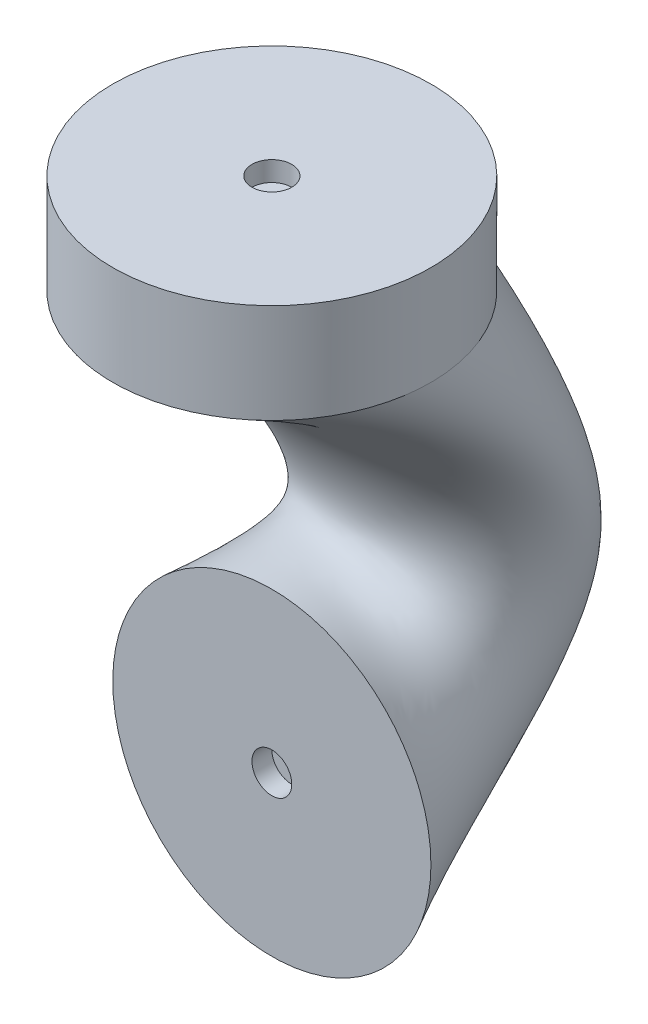
ISO-10303-21;
HEADER;
FILE_DESCRIPTION(('STEP AP214'),'2;1');
FILE_NAME('part.step','',(''),(''),'','','');
FILE_SCHEMA(('AUTOMOTIVE_DESIGN { 1 0 10303 214 1 1 1 1 }'));
ENDSEC;
DATA;
#1=APPLICATION_CONTEXT('core data for automotive mechanical design processes');
#2=APPLICATION_PROTOCOL_DEFINITION('international standard','automotive_design',2000,#1);
#3=PRODUCT_CONTEXT('',#1,'mechanical');
#4=PRODUCT('Part','Part','',(#3));
#5=PRODUCT_RELATED_PRODUCT_CATEGORY('part','',(#4));
#6=PRODUCT_DEFINITION_FORMATION('','',#4);
#7=PRODUCT_DEFINITION_CONTEXT('part definition',#1,'design');
#8=PRODUCT_DEFINITION('design','',#6,#7);
#9=PRODUCT_DEFINITION_SHAPE('','',#8);
#10=(LENGTH_UNIT() NAMED_UNIT(*) SI_UNIT(.MILLI.,.METRE.));
#11=(NAMED_UNIT(*) PLANE_ANGLE_UNIT() SI_UNIT($,.RADIAN.));
#12=(NAMED_UNIT(*) SI_UNIT($,.STERADIAN.) SOLID_ANGLE_UNIT());
#13=UNCERTAINTY_MEASURE_WITH_UNIT(LENGTH_MEASURE(1.E-05),#10,'distance_accuracy_value','');
#14=(GEOMETRIC_REPRESENTATION_CONTEXT(3) GLOBAL_UNCERTAINTY_ASSIGNED_CONTEXT((#13)) GLOBAL_UNIT_ASSIGNED_CONTEXT((#10,
#11,#12)) REPRESENTATION_CONTEXT('',''));
#15=CARTESIAN_POINT('',(0.,0.,0.));
#16=DIRECTION('',(0.,0.,1.));
#17=DIRECTION('',(1.,0.,0.));
#18=AXIS2_PLACEMENT_3D('',#15,#16,#17);
#19=CARTESIAN_POINT('',(0.,200.,-2.08794990940197E-12));
#20=DIRECTION('',(0.,1.,0.));
#21=DIRECTION('',(-1.,0.,0.));
#22=AXIS2_PLACEMENT_3D('',#19,#20,#21);
#23=CYLINDRICAL_SURFACE('',#22,10.);
#24=CARTESIAN_POINT('',(0.,250.,-2.61167211022844E-12));
#25=DIRECTION('',(0.,1.,0.));
#26=DIRECTION('',(-1.,0.,0.));
#27=AXIS2_PLACEMENT_3D('',#24,#25,#26);
#28=CIRCLE('',#27,10.);
#29=CARTESIAN_POINT('',(-10.,250.,-2.61167211022844E-12));
#30=VERTEX_POINT('',#29);
#31=EDGE_CURVE('E199',#30,#30,#28,.T.);
#32=ORIENTED_EDGE('',*,*,#31,.F.);
#33=EDGE_LOOP('',(#32));
#34=FACE_BOUND('',#33,.T.);
#35=CARTESIAN_POINT('',(0.,260.,-2.71641655039374E-12));
#36=DIRECTION('',(0.,1.,0.));
#37=DIRECTION('',(-1.,0.,0.));
#38=AXIS2_PLACEMENT_3D('',#35,#36,#37);
#39=CIRCLE('',#38,10.);
#40=CARTESIAN_POINT('',(-10.,260.,-2.71641655039374E-12));
#41=VERTEX_POINT('',#40);
#42=EDGE_CURVE('E202',#41,#41,#39,.T.);
#43=ORIENTED_EDGE('',*,*,#42,.T.);
#44=EDGE_LOOP('',(#43));
#45=FACE_BOUND('',#44,.T.);
#46=ADVANCED_FACE('F95',(#34,#45),#23,.F.);
#47=CARTESIAN_POINT('',(0.,0.,0.));
#48=DIRECTION('',(0.,0.,1.));
#49=DIRECTION('',(0.,-1.,0.));
#50=AXIS2_PLACEMENT_3D('',#47,#48,#49);
#51=PLANE('',#50);
#52=CARTESIAN_POINT('',(0.,0.,0.));
#53=DIRECTION('',(0.,0.,1.));
#54=DIRECTION('',(0.,-1.,0.));
#55=AXIS2_PLACEMENT_3D('',#52,#53,#54);
#56=CIRCLE('',#55,10.);
#57=CARTESIAN_POINT('',(0.,-10.,1.11683334069202E-13));
#58=VERTEX_POINT('',#57);
#59=EDGE_CURVE('E108',#58,#58,#56,.T.);
#60=ORIENTED_EDGE('',*,*,#59,.F.);
#61=EDGE_LOOP('',(#60));
#62=FACE_BOUND('',#61,.T.);
#63=CARTESIAN_POINT('',(74.3766084181839,29.4638782275543,-3.01678849100449E-13));
#64=CARTESIAN_POINT('',(74.7673126786554,28.4776109899567,-2.91348248134896E-13));
#65=CARTESIAN_POINT('',(75.5079415287326,26.4935866791247,-2.70566696563654E-13));
#66=CARTESIAN_POINT('',(76.4966022293078,23.4867166769649,-2.39071405061049E-13));
#67=CARTESIAN_POINT('',(77.3630367933986,20.4526491098914,-2.0729123418737E-13));
#68=CARTESIAN_POINT('',(81.8286259873764,2.10687414395702,0.));
#69=CARTESIAN_POINT('',(80.1643381849054,-16.1794419388319,1.7640955271089E-13));
#70=CARTESIAN_POINT('',(65.0037798739216,-51.231413755101,5.43559469169367E-13));
#71=CARTESIAN_POINT('',(49.1892229795066,-66.5625232087544,7.04144316852945E-13));
#72=CARTESIAN_POINT('',(9.7385334756019,-82.1906936276132,8.67840712986062E-13));
#73=CARTESIAN_POINT('',(-12.2847784036909,-81.8488446639036,8.64260035153576E-13));
#74=CARTESIAN_POINT('',(-51.231413755101,-65.0037798739216,6.87817347056099E-13));
#75=CARTESIAN_POINT('',(-66.5625232087544,-49.1892229795066,5.22168656219331E-13));
#76=CARTESIAN_POINT('',(-82.1906936276132,-9.73853347560186,1.08944617597196E-13));
#77=CARTESIAN_POINT('',(-81.8488446639035,12.284778403691,-1.21737329741023E-13));
#78=CARTESIAN_POINT('',(-65.0037798739215,51.231413755101,-5.29681681361553E-13));
#79=CARTESIAN_POINT('',(-49.1892229795066,66.5625232087545,-6.90266529045131E-13));
#80=CARTESIAN_POINT('',(-9.73853347560179,82.1906936276132,-8.53962925178247E-13));
#81=CARTESIAN_POINT('',(12.284778403691,81.8488446639035,-8.50382247345761E-13));
#82=CARTESIAN_POINT('',(47.3367502199601,66.6882863529197,-6.91583828058032E-13));
#83=CARTESIAN_POINT('',(61.0723686533143,54.5025571575691,-5.63945089800744E-13));
#84=CARTESIAN_POINT('',(70.3817879461326,38.0756384452672,-3.91882249384659E-13));
#85=CARTESIAN_POINT('',(71.8281958006555,35.2713240595763,-3.62508615346991E-13));
#86=CARTESIAN_POINT('',(73.1669105155484,32.4031260010594,-3.32465835354738E-13));
#87=CARTESIAN_POINT('',(73.9859041577124,30.4501454651519,-3.12009450066003E-13));
#88=CARTESIAN_POINT('',(74.3766084181839,29.4638782275543,-3.01678849100449E-13));
#89=B_SPLINE_CURVE_WITH_KNOTS('',3,(#63,#64,#65,#66,#67,#68,#69,#70,#71,#72,#73,#74,#75,#76,#77,
#78,#79,#80,#81,#82,#83,#84,#85,#86,#87,#88),.UNSPECIFIED.,.T.,.F.,(4,1,1,1,1,2,2,2,2,2,2,2,1,1,
1,1,4),(0.,0.00624999999999998,0.0125,0.01875,0.025,0.125,0.25,0.375,0.5,0.625,0.75,0.875,0.975,
0.98125,0.9875,0.99375,1.),.UNSPECIFIED.);
#90=CARTESIAN_POINT('',(74.3766084181839,29.4638782275543,-3.01678849100449E-13));
#91=VERTEX_POINT('',#90);
#92=EDGE_CURVE('E13',#91,#91,#89,.F.);
#93=ORIENTED_EDGE('',*,*,#92,.T.);
#94=EDGE_LOOP('',(#93));
#95=FACE_BOUND('',#94,.T.);
#96=ADVANCED_FACE('F139',(#62,#95),#51,.T.);
#97=CARTESIAN_POINT('',(-20.9124445285288,210.000000000001,77.2183246635206));
#98=CARTESIAN_POINT('',(-16.479288510747,178.04697238756,16.927761124029));
#99=CARTESIAN_POINT('',(7.97290448844534,107.13554131218,-62.0648444365816));
#100=CARTESIAN_POINT('',(47.0467467870615,57.6895578725962,-34.551121984985));
#101=CARTESIAN_POINT('',(74.3766084181839,29.4638782275543,-3.01678849100449E-13));
#102=CARTESIAN_POINT('',(-21.9363942000385,210.000000000001,76.9410162552022));
#103=CARTESIAN_POINT('',(-17.4927921986531,177.979945678043,16.9046435709561));
#104=CARTESIAN_POINT('',(7.17327205318328,107.068014364211,-61.8219465113336));
#105=CARTESIAN_POINT('',(46.4556548678449,58.2804291611886,-34.3892585919848));
#106=CARTESIAN_POINT('',(73.9859041577124,30.4501454651519,-3.12009450066003E-13));
#107=CARTESIAN_POINT('',(-23.9690905377756,210.000000000001,76.3468536864642));
#108=CARTESIAN_POINT('',(-19.5081001496207,177.834286971107,16.8223465787438));
#109=CARTESIAN_POINT('',(5.57494905105683,106.910570300343,-61.3625131813319));
#110=CARTESIAN_POINT('',(45.2491202418078,59.4361879625734,-34.0756116562607));
#111=CARTESIAN_POINT('',(73.1669105155484,32.4031260010594,-3.32465835354738E-13));
#112=CARTESIAN_POINT('',(-26.9696470115506,210.000000000001,75.3391940026237));
#113=CARTESIAN_POINT('',(-22.4932864421283,177.583726124774,16.5879829908779));
#114=CARTESIAN_POINT('',(3.1807616188368,106.602020962716,-60.74914467564));
#115=CARTESIAN_POINT('',(43.3719676117689,61.0980029372616,-33.6381141342307));
#116=CARTESIAN_POINT('',(71.8281958006555,35.2713240595763,-3.62508615346991E-13));
#117=CARTESIAN_POINT('',(-29.9188364355118,210.000000000001,74.2173399136202));
#118=CARTESIAN_POINT('',(-25.4382889264136,177.301715327059,16.2458708953967));
#119=CARTESIAN_POINT('',(0.793734005269491,106.223171149149,-60.2131490258429));
#120=CARTESIAN_POINT('',(41.4288055890974,62.6854142087252,-33.2324287762188));
#121=CARTESIAN_POINT('',(70.3817879461326,38.0756384452672,-3.91882249384659E-13));
#122=CARTESIAN_POINT('',(-47.2884965784981,210.000000000001,66.8143775020428));
#123=CARTESIAN_POINT('',(-42.8434226237478,175.444138044519,13.5374584792941));
#124=CARTESIAN_POINT('',(-13.4766151837944,103.509672699927,-57.4454912167663));
#125=CARTESIAN_POINT('',(29.3966648848724,71.7805538864299,-31.0035343017287));
#126=CARTESIAN_POINT('',(61.0723686533143,54.5025571575691,-5.63945089800744E-13));
#127=CARTESIAN_POINT('',(-60.9416507336906,210.000000000001,54.536324261253));
#128=CARTESIAN_POINT('',(-57.2610773241044,172.024425936059,6.26274381397339));
#129=CARTESIAN_POINT('',(-26.1595926233857,97.909609061726,-58.8827898720736));
#130=CARTESIAN_POINT('',(14.9443371550057,76.4341278999874,-30.1661441659222));
#131=CARTESIAN_POINT('',(47.3367502199601,66.6882863529197,-6.91583828058032E-13));
#132=CARTESIAN_POINT('',(-79.9480343450779,210.,21.4117014177239));
#133=CARTESIAN_POINT('',(-78.5606727052289,165.836245671341,-19.0081835076799));
#134=CARTESIAN_POINT('',(-48.0120348784579,77.5366388457216,-67.6121429012748));
#135=CARTESIAN_POINT('',(-17.0968981768952,80.4635866197993,-33.193478029005));
#136=CARTESIAN_POINT('',(12.284778403691,81.8488446639035,-8.50382247345761E-13));
#137=CARTESIAN_POINT('',(-82.7644928298903,210.,-0.43345109833598));
#138=CARTESIAN_POINT('',(-83.1193803946188,163.130008735237,-38.3940674676732));
#139=CARTESIAN_POINT('',(-55.7527110097061,61.7069744385726,-76.0272432080755));
#140=CARTESIAN_POINT('',(-34.3028051911507,77.9682598912986,-38.2091014399269));
#141=CARTESIAN_POINT('',(-9.73853347560179,82.1906936276132,-8.53962925178247E-13));
#142=CARTESIAN_POINT('',(-71.6721564971553,210.,-41.391437958726));
#143=CARTESIAN_POINT('',(-72.578742837601,153.695545466485,-77.2488737113557));
#144=CARTESIAN_POINT('',(-61.7379569900093,35.1832013304957,-99.3536126940505));
#145=CARTESIAN_POINT('',(-57.7227227931111,58.026105534669,-49.5505803677284));
#146=CARTESIAN_POINT('',(-49.1892229795066,66.5625232087545,-6.90266529045131E-13));
#147=CARTESIAN_POINT('',(-58.2168379105362,209.999999999999,-58.8298303324276));
#148=CARTESIAN_POINT('',(-57.9328738221215,146.967319133838,-95.0433540244161));
#149=CARTESIAN_POINT('',(-60.2267518868738,25.8343240878391,-112.988471744801));
#150=CARTESIAN_POINT('',(-62.323912650619,41.2181878354547,-55.8764358846081));
#151=CARTESIAN_POINT('',(-65.0037798739215,51.231413755101,-5.29681681361553E-13));
#152=CARTESIAN_POINT('',(-21.4117014177261,209.999999999999,-79.94803434508));
#153=CARTESIAN_POINT('',(-22.7511635730298,137.138305121617,-118.833964112987));
#154=CARTESIAN_POINT('',(-40.7670448564351,14.5751927748329,-139.619097107991));
#155=CARTESIAN_POINT('',(-63.1761815509074,5.23156452586233,-65.4823058011237));
#156=CARTESIAN_POINT('',(-81.8488446639035,12.284778403691,-1.21737329741023E-13));
#157=CARTESIAN_POINT('',(0.433451098333731,209.999999999999,-82.7644928298925));
#158=CARTESIAN_POINT('',(-3.71998772954883,134.037517442044,-123.966740734358));
#159=CARTESIAN_POINT('',(-24.0873685804441,13.1662226176816,-151.192663392265));
#160=CARTESIAN_POINT('',(-58.7386016618304,-12.3549270660522,-68.7623202007595));
#161=CARTESIAN_POINT('',(-82.1906936276132,-9.73853347560186,1.08944617597196E-13));
#162=CARTESIAN_POINT('',(41.3914379587238,209.999999999999,-71.6721564971575));
#163=CARTESIAN_POINT('',(33.6503913238313,133.525496937487,-120.768207796766));
#164=CARTESIAN_POINT('',(11.4345803013381,19.4792911053792,-163.342022956614));
#165=CARTESIAN_POINT('',(-38.3830653395039,-39.3672295244882,-73.0148621123306));
#166=CARTESIAN_POINT('',(-66.5625232087544,-49.1892229795066,5.22168656219331E-13));
#167=CARTESIAN_POINT('',(58.8298303324253,209.999999999999,-58.2168379105384));
#168=CARTESIAN_POINT('',(50.3151525631017,136.114264112502,-112.89037446873));
#169=CARTESIAN_POINT('',(28.7266875105664,26.5650208006011,-163.182931796873));
#170=CARTESIAN_POINT('',(-23.1040188351693,-47.1802196608126,-73.9873896242658));
#171=CARTESIAN_POINT('',(-51.231413755101,-65.0037798739216,6.87817347056099E-13));
#172=CARTESIAN_POINT('',(79.9480343450778,210.,-21.4117014177284));
#173=CARTESIAN_POINT('',(72.3506824095144,145.027642211429,-86.258435525366));
#174=CARTESIAN_POINT('',(54.7498272778525,46.9554109630576,-151.906318884129));
#175=CARTESIAN_POINT('',(10.9071492502553,-49.5796237071395,-72.0757274843176));
#176=CARTESIAN_POINT('',(-12.2847784036909,-81.8488446639036,8.64260035153576E-13));
#177=CARTESIAN_POINT('',(82.7644928298902,210.,0.433451098331511));
#178=CARTESIAN_POINT('',(76.8580978625182,151.35225313534,-69.0089953001694));
#179=CARTESIAN_POINT('',(62.5574205594818,58.8589107706721,-141.171713617728));
#180=CARTESIAN_POINT('',(28.0470568128815,-43.4773786852843,-69.1915378324343));
#181=CARTESIAN_POINT('',(9.7385334756019,-82.1906936276132,8.67840712986062E-13));
#182=CARTESIAN_POINT('',(71.6721564971553,210.,41.3914379587215));
#183=CARTESIAN_POINT('',(69.7349354829268,164.070931988119,-32.6686629915424));
#184=CARTESIAN_POINT('',(64.8346781782843,81.824283399931,-115.107280652724));
#185=CARTESIAN_POINT('',(54.8733812846055,-20.2682474155021,-60.3693798306452));
#186=CARTESIAN_POINT('',(49.1892229795066,-66.5625232087544,7.04144316852945E-13));
#187=CARTESIAN_POINT('',(58.2168379105362,210.000000000001,58.8298303324231));
#188=CARTESIAN_POINT('',(58.5578338812599,170.464999916986,-15.2522128787407));
#189=CARTESIAN_POINT('',(59.5485675632671,91.5409247633039,-101.053863082545));
#190=CARTESIAN_POINT('',(62.9469774635063,-3.80027109648996,-54.4314114807394));
#191=CARTESIAN_POINT('',(65.0037798739216,-51.231413755101,5.43559469169367E-13));
#192=CARTESIAN_POINT('',(25.0922150670072,210.000000000001,77.8362139438103));
#193=CARTESIAN_POINT('',(28.1934787177744,177.392473690888,7.68700276677027));
#194=CARTESIAN_POINT('',(40.6194354213015,103.740953729688,-78.7643197569746));
#195=CARTESIAN_POINT('',(65.0166149777151,26.6949752063923,-44.2363571581295));
#196=CARTESIAN_POINT('',(80.1643381849054,-16.1794419388319,1.7640955271089E-13));
#197=CARTESIAN_POINT('',(7.1090747541976,210.000000000001,81.5464530545583));
#198=CARTESIAN_POINT('',(11.0073783832344,178.932860207074,14.7550698439352));
#199=CARTESIAN_POINT('',(28.9870297617347,107.162789163047,-70.3416278971135));
#200=CARTESIAN_POINT('',(60.8174733894769,40.3350051343588,-39.6083794618469));
#201=CARTESIAN_POINT('',(81.8286259873764,2.10687414395702,0.));
#202=CARTESIAN_POINT('',(-11.6225233744263,210.000000000001,79.1723895554482));
#203=CARTESIAN_POINT('',(-7.32722260520973,178.493783865186,16.6524797938705));
#204=CARTESIAN_POINT('',(15.0768987981469,107.430495289993,-64.547814406318));
#205=CARTESIAN_POINT('',(51.9965977755641,52.1289820650858,-36.1291416347607));
#206=CARTESIAN_POINT('',(77.3630367933986,20.4526491098914,-2.0729123418737E-13));
#207=CARTESIAN_POINT('',(-14.7347836821256,210.000000000001,78.6526678678706));
#208=CARTESIAN_POINT('',(-10.3830940618268,178.383655994077,16.8606837186193));
#209=CARTESIAN_POINT('',(12.7329872879828,107.406517310527,-63.648581405188));
#210=CARTESIAN_POINT('',(50.437770659915,54.041395916966,-35.5744330886763));
#211=CARTESIAN_POINT('',(76.4966022293078,23.4867166769649,-2.39071405061049E-13));
#212=CARTESIAN_POINT('',(-17.8337647185702,210.000000000001,78.0084367552198));
#213=CARTESIAN_POINT('',(-13.4354502320373,178.236447228209,16.9587845160264));
#214=CARTESIAN_POINT('',(10.3649928356463,107.312550443409,-62.8162263106206));
#215=CARTESIAN_POINT('',(48.7924772074626,55.8990243346693,-35.0467920142615));
#216=CARTESIAN_POINT('',(75.5079415287326,26.4935866791247,-2.70566696563654E-13));
#217=CARTESIAN_POINT('',(-19.888494857019,210.000000000001,77.495633071839));
#218=CARTESIAN_POINT('',(-15.4657848228409,178.113999097077,16.9508786771019));
#219=CARTESIAN_POINT('',(8.77253692370738,107.203068260149,-62.3077423618295));
#220=CARTESIAN_POINT('',(47.6378387062781,57.0986865840038,-34.7129853779851));
#221=CARTESIAN_POINT('',(74.7673126786554,28.4776109899567,-2.91348248134896E-13));
#222=CARTESIAN_POINT('',(-20.9124445285288,210.000000000001,77.2183246635206));
#223=CARTESIAN_POINT('',(-16.479288510747,178.04697238756,16.927761124029));
#224=CARTESIAN_POINT('',(7.97290448844534,107.13554131218,-62.0648444365816));
#225=CARTESIAN_POINT('',(47.0467467870615,57.6895578725962,-34.551121984985));
#226=CARTESIAN_POINT('',(74.3766084181839,29.4638782275543,-3.01678849100449E-13));
#227=B_SPLINE_SURFACE_WITH_KNOTS('',3,3,((#97,#98,#99,#100,#101),(#102,#103,#104,#105,#106),
(#107,#108,#109,#110,#111),(#112,#113,#114,#115,#116),(#117,#118,#119,#120,#121),(#122,#123,
#124,#125,#126),(#127,#128,#129,#130,#131),(#132,#133,#134,#135,#136),(#137,#138,#139,#140,
#141),(#142,#143,#144,#145,#146),(#147,#148,#149,#150,#151),(#152,#153,#154,#155,#156),(#157,
#158,#159,#160,#161),(#162,#163,#164,#165,#166),(#167,#168,#169,#170,#171),(#172,#173,#174,#175,
#176),(#177,#178,#179,#180,#181),(#182,#183,#184,#185,#186),(#187,#188,#189,#190,#191),(#192,
#193,#194,#195,#196),(#197,#198,#199,#200,#201),(#202,#203,#204,#205,#206),(#207,#208,#209,#210,
#211),(#212,#213,#214,#215,#216),(#217,#218,#219,#220,#221),(#222,#223,#224,#225,#226)),
.UNSPECIFIED.,.T.,.F.,.F.,(4,1,1,1,1,2,2,2,2,2,2,2,1,1,1,1,4),(4,1,4),(0.,0.00625000000000009,
0.0125,0.01875,0.0249999999999999,0.125,0.25,0.375,0.5,0.625,0.75,0.875,0.975,0.98125,0.9875,
0.99375,1.),(0.,0.602345367840477,1.),.UNSPECIFIED.);
#228=CARTESIAN_POINT('',(-20.9124445285288,210.000000000001,77.2183246635205));
#229=CARTESIAN_POINT('',(-21.9363942000385,210.000000000001,76.9410162552021));
#230=CARTESIAN_POINT('',(-23.9690905377756,210.000000000001,76.3468536864641));
#231=CARTESIAN_POINT('',(-26.9696470115506,210.000000000001,75.3391940026237));
#232=CARTESIAN_POINT('',(-29.9188364355118,210.000000000001,74.2173399136202));
#233=CARTESIAN_POINT('',(-47.2884965784981,210.000000000001,66.8143775020427));
#234=CARTESIAN_POINT('',(-60.9416507336906,210.,54.5363242612529));
#235=CARTESIAN_POINT('',(-79.9480343450779,210.,21.4117014177238));
#236=CARTESIAN_POINT('',(-82.7644928298903,210.,-0.433451098336042));
#237=CARTESIAN_POINT('',(-71.6721564971553,209.999999999999,-41.3914379587261));
#238=CARTESIAN_POINT('',(-58.2168379105362,209.999999999999,-58.8298303324276));
#239=CARTESIAN_POINT('',(-21.4117014177261,209.999999999999,-79.9480343450801));
#240=CARTESIAN_POINT('',(0.433451098333725,209.999999999999,-82.7644928298925));
#241=CARTESIAN_POINT('',(41.3914379587238,209.999999999999,-71.6721564971576));
#242=CARTESIAN_POINT('',(58.8298303324253,209.999999999999,-58.2168379105385));
#243=CARTESIAN_POINT('',(79.9480343450778,210.,-21.4117014177285));
#244=CARTESIAN_POINT('',(82.7644928298902,210.,0.433451098331396));
#245=CARTESIAN_POINT('',(71.6721564971553,210.,41.3914379587214));
#246=CARTESIAN_POINT('',(58.2168379105362,210.,58.829830332423));
#247=CARTESIAN_POINT('',(25.0922150670072,210.000000000001,77.8362139438102));
#248=CARTESIAN_POINT('',(7.10907475419761,210.000000000001,81.5464530545582));
#249=CARTESIAN_POINT('',(-11.6225233744263,210.000000000001,79.1723895554481));
#250=CARTESIAN_POINT('',(-14.7347836821256,210.000000000001,78.6526678678705));
#251=CARTESIAN_POINT('',(-17.8337647185702,210.000000000001,78.0084367552197));
#252=CARTESIAN_POINT('',(-19.888494857019,210.000000000001,77.4956330718389));
#253=CARTESIAN_POINT('',(-20.9124445285288,210.000000000001,77.2183246635205));
#254=B_SPLINE_CURVE_WITH_KNOTS('',3,(#228,#229,#230,#231,#232,#233,#234,#235,#236,#237,#238,
#239,#240,#241,#242,#243,#244,#245,#246,#247,#248,#249,#250,#251,#252,#253),.UNSPECIFIED.,.T.,
.F.,(4,1,1,1,1,2,2,2,2,2,2,2,1,1,1,1,4),(0.,0.00625000000000009,0.0125,0.01875,
0.0249999999999999,0.125,0.25,0.375,0.5,0.625,0.75,0.875,0.975,0.98125,0.9875,0.99375,1.),.UNSPECIFIED.);
#255=CARTESIAN_POINT('',(-20.9124445285288,210.000000000001,77.2183246635205));
#256=VERTEX_POINT('',#255);
#257=EDGE_CURVE('E120',#256,#256,#254,.T.);
#258=ORIENTED_EDGE('',*,*,#257,.T.);
#259=EDGE_LOOP('',(#258));
#260=FACE_BOUND('',#259,.T.);
#261=ORIENTED_EDGE('',*,*,#92,.F.);
#262=EDGE_LOOP('',(#261));
#263=FACE_BOUND('',#262,.T.);
#264=ADVANCED_FACE('F124',(#260,#263),#227,.T.);
#265=CARTESIAN_POINT('',(0.,-1.32500015780923E-13,-9.99999999999999));
#266=DIRECTION('',(0.,0.,1.));
#267=DIRECTION('',(0.,-1.,0.));
#268=AXIS2_PLACEMENT_3D('',#265,#266,#267);
#269=CYLINDRICAL_SURFACE('',#268,10.);
#270=CARTESIAN_POINT('',(0.,-1.32500015780923E-13,-9.99999999999999));
#271=DIRECTION('',(0.,0.,1.));
#272=DIRECTION('',(0.,-1.,0.));
#273=AXIS2_PLACEMENT_3D('',#270,#271,#272);
#274=CIRCLE('',#273,10.);
#275=CARTESIAN_POINT('',(0.,-10.0000000000001,-9.99999999999989));
#276=VERTEX_POINT('',#275);
#277=EDGE_CURVE('E94',#276,#276,#274,.T.);
#278=ORIENTED_EDGE('',*,*,#277,.F.);
#279=EDGE_LOOP('',(#278));
#280=FACE_BOUND('',#279,.T.);
#281=ORIENTED_EDGE('',*,*,#59,.T.);
#282=EDGE_LOOP('',(#281));
#283=FACE_BOUND('',#282,.T.);
#284=ADVANCED_FACE('F140',(#280,#283),#269,.F.);
#285=CARTESIAN_POINT('',(0.,-1.32500015780923E-13,-9.99999999999999));
#286=DIRECTION('',(0.,0.,1.));
#287=DIRECTION('',(0.,-1.,0.));
#288=AXIS2_PLACEMENT_3D('',#285,#286,#287);
#289=PLANE('',#288);
#290=ORIENTED_EDGE('',*,*,#277,.T.);
#291=EDGE_LOOP('',(#290));
#292=FACE_BOUND('',#291,.T.);
#293=ADVANCED_FACE('F186',(#292),#289,.T.);
#294=CARTESIAN_POINT('',(0.,260.,-2.71641655039374E-12));
#295=DIRECTION('',(0.,-1.,0.));
#296=DIRECTION('',(1.,0.,0.));
#297=AXIS2_PLACEMENT_3D('',#294,#295,#296);
#298=CYLINDRICAL_SURFACE('',#297,80.);
#299=CARTESIAN_POINT('',(0.,260.,-2.71641655039374E-12));
#300=DIRECTION('',(0.,1.,0.));
#301=DIRECTION('',(-1.,0.,0.));
#302=AXIS2_PLACEMENT_3D('',#299,#300,#301);
#303=CIRCLE('',#302,80.);
#304=CARTESIAN_POINT('',(-80.,260.,-2.71641655039374E-12));
#305=VERTEX_POINT('',#304);
#306=EDGE_CURVE('E113',#305,#305,#303,.T.);
#307=ORIENTED_EDGE('',*,*,#306,.F.);
#308=EDGE_LOOP('',(#307));
#309=FACE_BOUND('',#308,.T.);
#310=ORIENTED_EDGE('',*,*,#257,.F.);
#311=EDGE_LOOP('',(#310));
#312=FACE_BOUND('',#311,.T.);
#313=ADVANCED_FACE('F141',(#309,#312),#298,.T.);
#314=CARTESIAN_POINT('',(0.,260.,-2.71641655039374E-12));
#315=DIRECTION('',(0.,1.,0.));
#316=DIRECTION('',(-1.,0.,0.));
#317=AXIS2_PLACEMENT_3D('',#314,#315,#316);
#318=PLANE('',#317);
#319=ORIENTED_EDGE('',*,*,#42,.F.);
#320=EDGE_LOOP('',(#319));
#321=FACE_BOUND('',#320,.T.);
#322=ORIENTED_EDGE('',*,*,#306,.T.);
#323=EDGE_LOOP('',(#322));
#324=FACE_BOUND('',#323,.T.);
#325=ADVANCED_FACE('F181',(#321,#324),#318,.T.);
#326=CARTESIAN_POINT('',(0.,250.,-2.61167211022844E-12));
#327=DIRECTION('',(0.,1.,0.));
#328=DIRECTION('',(-1.,0.,0.));
#329=AXIS2_PLACEMENT_3D('',#326,#327,#328);
#330=PLANE('',#329);
#331=ORIENTED_EDGE('',*,*,#31,.T.);
#332=EDGE_LOOP('',(#331));
#333=FACE_BOUND('',#332,.T.);
#334=ADVANCED_FACE('F138',(#333),#330,.T.);
#335=CLOSED_SHELL('',(#46,#96,#264,#284,#293,#313,#325,#334));
#336=MANIFOLD_SOLID_BREP('B2',#335);
#337=ADVANCED_BREP_SHAPE_REPRESENTATION('',(#18,#336),#14);
#338=SHAPE_DEFINITION_REPRESENTATION(#9,#337);
ENDSEC;
END-ISO-10303-21;
